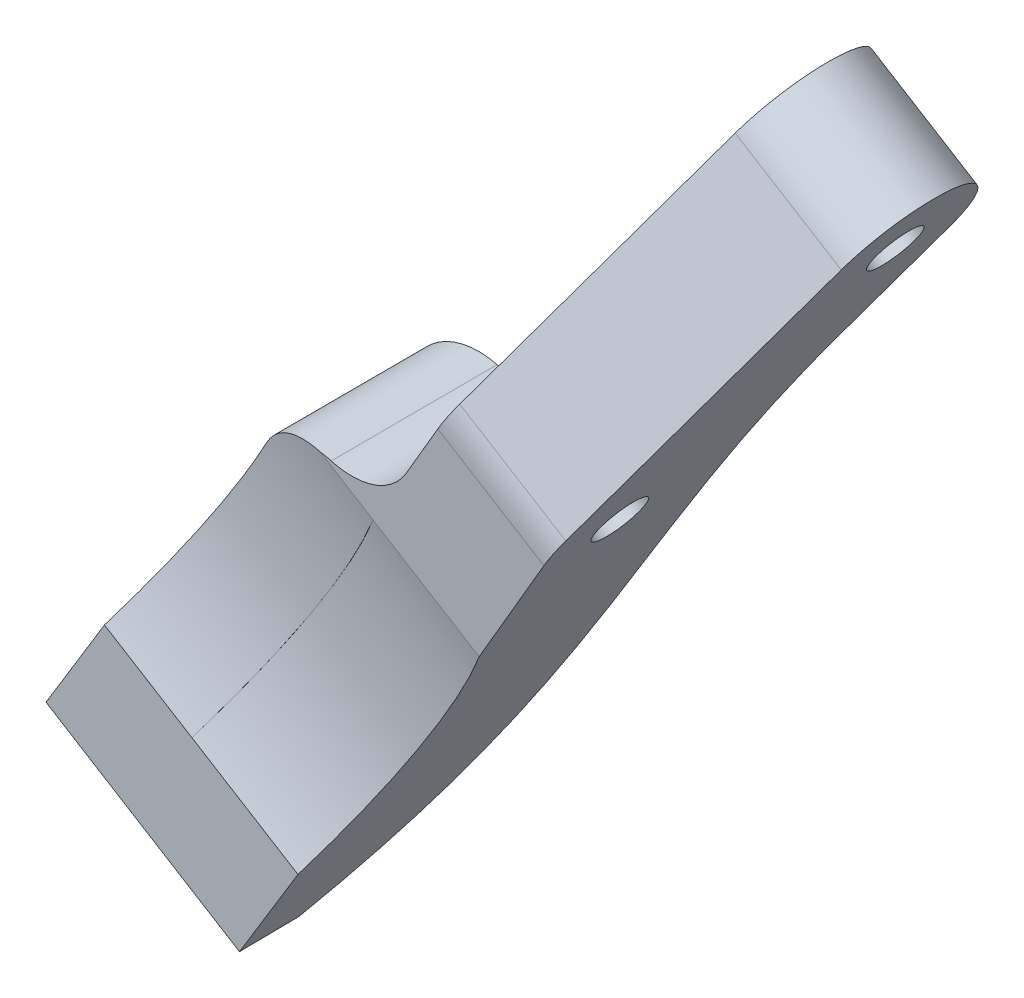
ISO-10303-21;
HEADER;
FILE_DESCRIPTION(('STEP AP214'),'2;1');
FILE_NAME('part.step','',(''),(''),'','','');
FILE_SCHEMA(('AUTOMOTIVE_DESIGN { 1 0 10303 214 1 1 1 1 }'));
ENDSEC;
DATA;
#1=APPLICATION_CONTEXT('core data for automotive mechanical design processes');
#2=APPLICATION_PROTOCOL_DEFINITION('international standard','automotive_design',2000,#1);
#3=PRODUCT_CONTEXT('',#1,'mechanical');
#4=PRODUCT('Part','Part','',(#3));
#5=PRODUCT_RELATED_PRODUCT_CATEGORY('part','',(#4));
#6=PRODUCT_DEFINITION_FORMATION('','',#4);
#7=PRODUCT_DEFINITION_CONTEXT('part definition',#1,'design');
#8=PRODUCT_DEFINITION('design','',#6,#7);
#9=PRODUCT_DEFINITION_SHAPE('','',#8);
#10=(LENGTH_UNIT() NAMED_UNIT(*) SI_UNIT(.MILLI.,.METRE.));
#11=(NAMED_UNIT(*) PLANE_ANGLE_UNIT() SI_UNIT($,.RADIAN.));
#12=(NAMED_UNIT(*) SI_UNIT($,.STERADIAN.) SOLID_ANGLE_UNIT());
#13=UNCERTAINTY_MEASURE_WITH_UNIT(LENGTH_MEASURE(1.E-05),#10,'distance_accuracy_value','');
#14=(GEOMETRIC_REPRESENTATION_CONTEXT(3) GLOBAL_UNCERTAINTY_ASSIGNED_CONTEXT((#13)) GLOBAL_UNIT_ASSIGNED_CONTEXT((#10,
#11,#12)) REPRESENTATION_CONTEXT('',''));
#15=CARTESIAN_POINT('',(0.,0.,0.));
#16=DIRECTION('',(0.,0.,1.));
#17=DIRECTION('',(1.,0.,0.));
#18=AXIS2_PLACEMENT_3D('',#15,#16,#17);
#19=CARTESIAN_POINT('',(-145.465846065261,199.758902537382,63.4536295403305));
#20=DIRECTION('',(-0.849388113162932,0.527762814669667,0.00249893366544897));
#21=DIRECTION('',(-0.527764462529552,-0.84939076524936,0.));
#22=AXIS2_PLACEMENT_3D('',#19,#20,#21);
#23=PLANE('',#22);
#24=CARTESIAN_POINT('',(-137.431299521987,212.655895269951,70.6147412750275));
#25=DIRECTION('',(0.849388113162932,-0.527762814669668,-0.00249893366544826));
#26=DIRECTION('',(0.527764462529552,0.84939076524936,0.));
#27=AXIS2_PLACEMENT_3D('',#24,#25,#26);
#28=CIRCLE('',#27,1.75000000000017);
#29=CARTESIAN_POINT('',(-136.50771171256,214.142329109138,70.6147412750275));
#30=VERTEX_POINT('',#29);
#31=EDGE_CURVE('E465',#30,#30,#28,.T.);
#32=ORIENTED_EDGE('',*,*,#31,.F.);
#33=EDGE_LOOP('',(#32));
#34=FACE_BOUND('',#33,.T.);
#35=DIRECTION('',(-0.490876600540356,-0.791744449357565,0.363566898869286));
#36=VECTOR('',#35,1.);
#37=CARTESIAN_POINT('',(-137.026355520671,213.283583566107,75.6905379942665));
#38=LINE('',#37,#36);
#39=CARTESIAN_POINT('',(-125.662736276465,231.6121868267,67.2740932014216));
#40=VERTEX_POINT('',#39);
#41=CARTESIAN_POINT('',(-136.462021488353,214.193808940833,75.2725649765459));
#42=VERTEX_POINT('',#41);
#43=EDGE_CURVE('E396',#40,#42,#38,.T.);
#44=ORIENTED_EDGE('',*,*,#43,.T.);
#45=CARTESIAN_POINT('',(-137.431299521987,212.655895269951,70.6147412750274));
#46=DIRECTION('',(-0.849388113162932,0.527762814669667,0.00249893366544897));
#47=DIRECTION('',(-0.527764462529552,-0.84939076524936,0.));
#48=AXIS2_PLACEMENT_3D('',#45,#46,#47);
#49=CIRCLE('',#48,5.);
#50=CARTESIAN_POINT('',(-137.631356269382,212.31032226088,75.5987714307571));
#51=VERTEX_POINT('',#50);
#52=EDGE_CURVE('E12',#42,#51,#49,.F.);
#53=ORIENTED_EDGE('',*,*,#52,.T.);
#54=DIRECTION('',(-0.526249869482533,-0.846575208276272,-0.079821623646753));
#55=VECTOR('',#54,1.);
#56=CARTESIAN_POINT('',(-142.838770843056,203.933183694321,74.8089103583332));
#57=LINE('',#56,#55);
#58=CARTESIAN_POINT('',(-142.838770843056,203.933183694321,74.8089103583333));
#59=VERTEX_POINT('',#58);
#60=EDGE_CURVE('E398',#51,#59,#57,.T.);
#61=ORIENTED_EDGE('',*,*,#60,.T.);
#62=CARTESIAN_POINT('',(-147.368661795779,196.520400632689,100.642218728456));
#63=DIRECTION('',(-0.849388113162932,0.527762814669667,0.00249893366544821));
#64=DIRECTION('',(-0.527764462529552,-0.84939076524936,0.));
#65=AXIS2_PLACEMENT_3D('',#62,#63,#64);
#66=CIRCLE('',#65,27.2548910492821);
#67=CARTESIAN_POINT('',(-153.799234271672,186.286623782076,76.2138206002041));
#68=VERTEX_POINT('',#67);
#69=EDGE_CURVE('E405',#59,#68,#66,.T.);
#70=ORIENTED_EDGE('',*,*,#69,.T.);
#71=DIRECTION('',(-0.52760719811768,-0.849001485928969,-0.0287597180934248));
#72=VECTOR('',#71,1.);
#73=CARTESIAN_POINT('',(-158.020091856613,179.494611894644,75.9837428554567));
#74=LINE('',#73,#72);
#75=CARTESIAN_POINT('',(-158.020091856613,179.494611894644,75.9837428554567));
#76=VERTEX_POINT('',#75);
#77=EDGE_CURVE('E403',#68,#76,#74,.T.);
#78=ORIENTED_EDGE('',*,*,#77,.T.);
#79=DIRECTION('',(0.0130567113748942,0.0257466180759731,-0.999583230124297));
#80=VECTOR('',#79,1.);
#81=CARTESIAN_POINT('',(-157.967865011114,179.597598366948,71.9854099349596));
#82=LINE('',#81,#80);
#83=CARTESIAN_POINT('',(-157.967865011114,179.597598366948,71.9854099349596));
#84=VERTEX_POINT('',#83);
#85=EDGE_CURVE('E176',#76,#84,#82,.T.);
#86=ORIENTED_EDGE('',*,*,#85,.T.);
#87=CARTESIAN_POINT('',(-157.967865011114,179.597598366948,71.9854099349596));
#88=CARTESIAN_POINT('',(-150.903306301804,191.036408616379,57.4085919158969));
#89=CARTESIAN_POINT('',(-140.393177536833,207.904078200175,67.432733277616));
#90=CARTESIAN_POINT('',(-131.869451995061,221.652161482444,61.119650807146));
#91=B_SPLINE_CURVE_WITH_KNOTS('',3,(#87,#88,#89,#90),.UNSPECIFIED.,.F.,.F.,(4,4),(0.,1.),.UNSPECIFIED.);
#92=CARTESIAN_POINT('',(-131.869451995061,221.652161482444,61.119650807146));
#93=VERTEX_POINT('',#92);
#94=EDGE_CURVE('E168',#84,#93,#91,.T.);
#95=ORIENTED_EDGE('',*,*,#94,.T.);
#96=DIRECTION('',(0.490876600540355,0.791744449357564,-0.36356689886929));
#97=VECTOR('',#96,1.);
#98=CARTESIAN_POINT('',(-127.601292343734,228.536359484936,57.9584457983846));
#99=LINE('',#98,#97);
#100=CARTESIAN_POINT('',(-127.601292343734,228.536359484936,57.9584457983846));
#101=VERTEX_POINT('',#100);
#102=EDGE_CURVE('E157',#93,#101,#99,.T.);
#103=ORIENTED_EDGE('',*,*,#102,.T.);
#104=CARTESIAN_POINT('',(-126.632014310099,230.074273155818,62.6162694999031));
#105=DIRECTION('',(0.849388113162932,-0.527762814669667,-0.00249893366544821));
#106=DIRECTION('',(-0.527764462529552,-0.84939076524936,0.));
#107=AXIS2_PLACEMENT_3D('',#104,#105,#106);
#108=CIRCLE('',#107,4.99999999999998);
#109=EDGE_CURVE('E166',#101,#40,#108,.T.);
#110=ORIENTED_EDGE('',*,*,#109,.T.);
#111=EDGE_LOOP('',(#44,#53,#61,#70,#78,#86,#95,#103,#110));
#112=FACE_BOUND('',#111,.T.);
#113=CARTESIAN_POINT('',(-126.632014310099,230.074273155818,62.6162694999032));
#114=DIRECTION('',(0.849388113162932,-0.527762814669668,-0.00249893366544826));
#115=DIRECTION('',(0.527764462529552,0.84939076524936,0.));
#116=AXIS2_PLACEMENT_3D('',#113,#114,#115);
#117=CIRCLE('',#116,1.75000000000017);
#118=CARTESIAN_POINT('',(-125.708426500672,231.560706995004,62.6162694999032));
#119=VERTEX_POINT('',#118);
#120=EDGE_CURVE('E452',#119,#119,#117,.T.);
#121=ORIENTED_EDGE('',*,*,#120,.F.);
#122=EDGE_LOOP('',(#121));
#123=FACE_BOUND('',#122,.T.);
#124=ADVANCED_FACE('F53',(#34,#112,#123),#23,.F.);
#125=CARTESIAN_POINT('',(-130.428152235647,240.05689299818,65.4774996432315));
#126=DIRECTION('',(0.849388113162932,-0.527762814669667,-0.00249893366544821));
#127=DIRECTION('',(-0.193855606726907,-0.307582734176409,-0.931564740303704));
#128=AXIS2_PLACEMENT_3D('',#125,#126,#127);
#129=PLANE('',#128);
#130=CARTESIAN_POINT('',(-154.588460757663,201.00638455738,100.663459664612));
#131=DIRECTION('',(-0.849388113162932,0.527762814669667,0.00249893366544821));
#132=DIRECTION('',(-0.527764462529552,-0.84939076524936,0.));
#133=AXIS2_PLACEMENT_3D('',#130,#131,#132);
#134=CIRCLE('',#133,27.2548910492821);
#135=CARTESIAN_POINT('',(-150.058569804941,208.419167619013,74.8301512944895));
#136=VERTEX_POINT('',#135);
#137=CARTESIAN_POINT('',(-155.611855002644,199.488080143753,73.4701424334406));
#138=VERTEX_POINT('',#137);
#139=EDGE_CURVE('E182',#136,#138,#134,.T.);
#140=ORIENTED_EDGE('',*,*,#139,.F.);
#141=CARTESIAN_POINT('',(-150.058569804941,208.419167619013,74.8301512944896));
#142=CARTESIAN_POINT('',(-151.869827243608,205.509300518767,73.7333286059708));
#143=CARTESIAN_POINT('',(-153.727835402388,202.521388485417,73.2286415312521));
#144=CARTESIAN_POINT('',(-155.622355851571,199.471173608172,73.4714808235708));
#145=CARTESIAN_POINT('',(-157.513723707257,196.426034467948,73.713916017019));
#146=CARTESIAN_POINT('',(-159.311794851092,193.527599228967,74.6847635834588));
#147=CARTESIAN_POINT('',(-161.019033233556,190.772607706768,76.2350615363604));
#148=(BOUNDED_CURVE() B_SPLINE_CURVE(3,(#141,#142,#143,#144,#145,#146,#147),.UNSPECIFIED.,.F.,
.F.) B_SPLINE_CURVE_WITH_KNOTS((4,3,4),(0.,1.07962493738538,2.15745331535274),
.UNSPECIFIED.) CURVE() GEOMETRIC_REPRESENTATION_ITEM() RATIONAL_B_SPLINE_CURVE((1.,1.,1.,1.,1.,
1.,1.)) REPRESENTATION_ITEM(''));
#149=EDGE_CURVE('E221',#136,#138,#148,.T.);
#150=ORIENTED_EDGE('',*,*,#149,.T.);
#151=EDGE_LOOP('',(#140,#150));
#152=FACE_BOUND('',#151,.T.);
#153=ADVANCED_FACE('F309',(#152),#129,.T.);
#154=CARTESIAN_POINT('',(-215.42898922936,132.511668818373,148.288861039054));
#155=CARTESIAN_POINT('',(-192.415208294728,118.212177674066,148.221153578759));
#156=CARTESIAN_POINT('',(-203.112082646933,152.454989137968,122.874491480027));
#157=CARTESIAN_POINT('',(-180.098301712301,138.155497993662,122.806784019732));
#158=CARTESIAN_POINT('',(-190.795176064506,172.398309457565,97.4601219209998));
#159=CARTESIAN_POINT('',(-167.781395129874,158.098818313259,97.3924144607051));
#160=CARTESIAN_POINT('',(-178.478269482079,192.341629777161,72.0457523619727));
#161=CARTESIAN_POINT('',(-155.464488547447,178.042138632855,71.978044901678));
#162=CARTESIAN_POINT('',(-171.41371077277,203.780440026592,57.4689343429102));
#163=CARTESIAN_POINT('',(-148.399929838138,189.480948882286,57.4012268826155));
#164=CARTESIAN_POINT('',(-160.903582007799,220.648109610388,67.4930757046292));
#165=CARTESIAN_POINT('',(-137.889801073167,206.348618466081,67.4253682443345));
#166=CARTESIAN_POINT('',(-152.379856466026,234.396192892657,61.1799932341592));
#167=CARTESIAN_POINT('',(-129.366075531394,220.096701748351,61.1122857738645));
#168=(BOUNDED_SURFACE() B_SPLINE_SURFACE(3,1,((#154,#155),(#156,#157),(#158,#159),(#160,#161),
(#162,#163),(#164,#165),(#166,#167)),.UNSPECIFIED.,.F.,.F.,.F.) B_SPLINE_SURFACE_WITH_KNOTS((4,
3,4),(2,2),(-1.74347855106593,0.,1.),(-1.56472704328177,1.14472704231095),
.UNSPECIFIED.) GEOMETRIC_REPRESENTATION_ITEM() RATIONAL_B_SPLINE_SURFACE(((1.,1.),(1.,1.),(1.,
1.),(1.,1.),(1.,1.),(1.,1.),(1.,1.))) REPRESENTATION_ITEM('') SURFACE());
#169=CARTESIAN_POINT('',(-152.920866902529,210.497951347866,63.5029667227939));
#170=CARTESIAN_POINT('',(-152.625070573472,210.422023509831,63.5033189485374));
#171=CARTESIAN_POINT('',(-152.323532656278,210.373505854643,63.5040097877256));
#172=CARTESIAN_POINT('',(-152.020063003257,210.352678450499,63.5050106707307));
#173=CARTESIAN_POINT('',(-151.731963425906,210.332905908925,63.5059608611957));
#174=CARTESIAN_POINT('',(-151.442122563601,210.338090176062,63.5071919140641));
#175=CARTESIAN_POINT('',(-151.153803010597,210.368466569789,63.508638932181));
#176=CARTESIAN_POINT('',(-151.123871372667,210.371620068084,63.5087891530796));
#177=CARTESIAN_POINT('',(-151.093979844519,210.375042542246,63.508941533581));
#178=CARTESIAN_POINT('',(-151.064131939828,210.378733007705,63.5090959555785));
#179=CARTESIAN_POINT('',(-150.792789154086,210.412282470854,63.5104997825942));
#180=CARTESIAN_POINT('',(-150.525051019552,210.467980538837,63.5120764742786));
#181=CARTESIAN_POINT('',(-150.263560887233,210.545081957469,63.513709997375));
#182=CARTESIAN_POINT('',(-150.007429878296,210.62060321699,63.5153100421456));
#183=CARTESIAN_POINT('',(-149.757293345746,210.716659593348,63.5169646670379));
#184=CARTESIAN_POINT('',(-149.515642369181,210.832539781408,63.5185150778539));
#185=CARTESIAN_POINT('',(-149.314041200464,210.92921467044,63.5198085327241));
#186=CARTESIAN_POINT('',(-149.119491003492,211.039138170561,63.5210204818501));
#187=CARTESIAN_POINT('',(-148.933217406361,211.161448571951,63.5220390164212));
#188=CARTESIAN_POINT('',(-148.654553579997,211.344423963957,63.5235627360747));
#189=CARTESIAN_POINT('',(-148.394412394015,211.555121670087,63.524653800545));
#190=CARTESIAN_POINT('',(-148.156907402327,211.79064057354,63.5248944444397));
#191=CARTESIAN_POINT('',(-148.009830541506,211.936487533378,63.5250434650911));
#192=CARTESIAN_POINT('',(-147.871959109773,212.091332798125,63.5248644520813));
#193=CARTESIAN_POINT('',(-147.744090562788,212.25428151565,63.5242673426161));
#194=CARTESIAN_POINT('',(-147.684410298605,212.330334796457,63.5239886528878));
#195=CARTESIAN_POINT('',(-147.626948730309,212.40810274853,63.5236191892214));
#196=CARTESIAN_POINT('',(-147.571778281306,212.487487363484,63.5231510863646));
#197=CARTESIAN_POINT('',(-147.522894809596,212.557825663234,63.5227363264131));
#198=CARTESIAN_POINT('',(-147.475827375424,212.629408217179,63.5222442769016));
#199=CARTESIAN_POINT('',(-147.430622514171,212.702164207707,63.5216702162684));
#200=(BOUNDED_CURVE() B_SPLINE_CURVE(3,(#169,#170,#171,#172,#173,#174,#175,#176,#177,#178,#179,
#180,#181,#182,#183,#184,#185,#186,#187,#188,#189,#190,#191,#192,#193,#194,#195,#196,#197,#198,
#199),.UNSPECIFIED.,.F.,.F.) B_SPLINE_CURVE_WITH_KNOTS((4,3,3,3,3,3,3,3,3,3,4),(0.,
0.09161580979346,0.178591478752063,0.187620780458526,0.269704796193467,0.350106536715364,
0.417182966889678,0.517528775308878,0.579668717690687,0.608671379135495,0.63436902716781),
.UNSPECIFIED.) CURVE() GEOMETRIC_REPRESENTATION_ITEM() RATIONAL_B_SPLINE_CURVE((1.,1.,1.,1.,1.,
1.,1.,1.,1.,1.,1.,1.,1.,1.,1.,1.,1.,1.,1.,1.,1.,1.,1.,1.,1.,1.,1.,1.,1.,1.,1.)) REPRESENTATION_ITEM(''));
#201=CARTESIAN_POINT('',(-152.920866910743,210.497951349974,63.5029667227468));
#202=VERTEX_POINT('',#201);
#203=CARTESIAN_POINT('',(-147.430622514171,212.702164207707,63.5216702162684));
#204=VERTEX_POINT('',#203);
#205=EDGE_CURVE('E495',#202,#204,#200,.T.);
#206=CARTESIAN_POINT('',(-165.187663972998,184.08358229164,72.0066508711159));
#207=CARTESIAN_POINT('',(-158.123105263689,195.522392541071,57.4298328520532));
#208=CARTESIAN_POINT('',(-147.612976498718,212.390062124867,67.4539742137723));
#209=CARTESIAN_POINT('',(-139.089250956945,226.138145407136,61.1408917433023));
#210=(BOUNDED_CURVE() B_SPLINE_CURVE(3,(#206,#207,#208,#209),.UNSPECIFIED.,.F.,
.F.) B_SPLINE_CURVE_WITH_KNOTS((4,4),(-5.55049235151538,0.),
.UNSPECIFIED.) CURVE() GEOMETRIC_REPRESENTATION_ITEM() RATIONAL_B_SPLINE_CURVE((1.,1.,1.,1.)) REPRESENTATION_ITEM(''));
#211=CARTESIAN_POINT('',(-165.187663972998,184.08358229164,72.0066508711157));
#212=VERTEX_POINT('',#211);
#213=EDGE_CURVE('E186',#212,#204,#210,.T.);
#214=DIRECTION('',(0.849388113162932,-0.527762814669667,-0.00249893366544821));
#215=VECTOR('',#214,1.);
#216=CARTESIAN_POINT('',(-165.187663972998,184.08358229164,72.0066508711158));
#217=LINE('',#216,#215);
#218=CARTESIAN_POINT('',(-171.133380765138,187.777921994327,72.0241434067739));
#219=VERTEX_POINT('',#218);
#220=EDGE_CURVE('E475',#219,#212,#217,.T.);
#221=CARTESIAN_POINT('',(-208.084100512419,127.947961035539,148.267252083855));
#222=CARTESIAN_POINT('',(-195.767193929992,147.891281355135,122.852882524828));
#223=CARTESIAN_POINT('',(-183.450287347565,167.834601674731,97.438512965801));
#224=CARTESIAN_POINT('',(-171.133380765138,187.777921994327,72.0241434067739));
#225=CARTESIAN_POINT('',(-164.068822055829,199.216732243758,57.4473253877114));
#226=CARTESIAN_POINT('',(-153.558693290858,216.084401827554,67.4714667494304));
#227=CARTESIAN_POINT('',(-145.034967749085,229.832485109823,61.1583842789604));
#228=(BOUNDED_CURVE() B_SPLINE_CURVE(3,(#221,#222,#223,#224,#225,#226,#227),.UNSPECIFIED.,.F.,
.F.) B_SPLINE_CURVE_WITH_KNOTS((4,3,4),(-1.74347855106593,0.,1.),
.UNSPECIFIED.) CURVE() GEOMETRIC_REPRESENTATION_ITEM() RATIONAL_B_SPLINE_CURVE((1.,1.,1.,1.,1.,
1.,1.)) REPRESENTATION_ITEM(''));
#229=CARTESIAN_POINT('',(-158.411097440024,208.293742716824,63.4880780384255));
#230=VERTEX_POINT('',#229);
#231=EDGE_CURVE('E292',#219,#230,#228,.T.);
#232=CARTESIAN_POINT('',(-152.920866910743,210.497951349974,63.502966722784));
#233=CARTESIAN_POINT('',(-153.220909769043,210.574970832685,63.5026094585843));
#234=CARTESIAN_POINT('',(-153.527419108996,210.623927456602,63.501906612146));
#235=CARTESIAN_POINT('',(-153.836420053296,210.644215899626,63.5008934937187));
#236=CARTESIAN_POINT('',(-153.99280034612,210.654483546763,63.5003807711551));
#237=CARTESIAN_POINT('',(-154.149818649104,210.657408907709,63.4997891417239));
#238=CARTESIAN_POINT('',(-154.306958706712,210.652915168688,63.4991282446655));
#239=CARTESIAN_POINT('',(-154.587633633984,210.64488869923,63.4979477866931));
#240=CARTESIAN_POINT('',(-154.866632621486,210.613251530309,63.4965519137593));
#241=CARTESIAN_POINT('',(-155.141043813619,210.558579037911,63.4950429141149));
#242=CARTESIAN_POINT('',(-155.400193485323,210.506947184464,63.4936178382665));
#243=CARTESIAN_POINT('',(-155.655251444462,210.434771052176,63.4920917563712));
#244=CARTESIAN_POINT('',(-155.903758492344,210.342545743858,63.4905989653951));
#245=CARTESIAN_POINT('',(-155.918393260596,210.337114525606,63.4905110538041));
#246=CARTESIAN_POINT('',(-155.933005307573,210.3316137774,63.4904232723661));
#247=CARTESIAN_POINT('',(-155.947594130287,210.326043601494,63.4903356540845));
#248=CARTESIAN_POINT('',(-156.218189979307,210.222727075682,63.4887104959914));
#249=CARTESIAN_POINT('',(-156.478764639441,210.096298152666,63.4871492261361));
#250=CARTESIAN_POINT('',(-156.726523924577,209.948434991423,63.4858886253975));
#251=CARTESIAN_POINT('',(-156.984513672702,209.794466272532,63.4845759720014));
#252=CARTESIAN_POINT('',(-157.228607598695,209.617257047752,63.4835906450292));
#253=CARTESIAN_POINT('',(-157.455647324277,209.418707579144,63.4832484041851));
#254=CARTESIAN_POINT('',(-157.670735023104,209.230610327897,63.4829241798874));
#255=CARTESIAN_POINT('',(-157.869302786081,209.024421782541,63.4831829924299));
#256=CARTESIAN_POINT('',(-158.049168061128,208.802406391855,63.4842779313432));
#257=CARTESIAN_POINT('',(-158.180291812457,208.640554745551,63.485076153778));
#258=CARTESIAN_POINT('',(-158.301170245839,208.470669263527,63.4863171980779));
#259=CARTESIAN_POINT('',(-158.411097440165,208.293742716597,63.4880780384292));
#260=(BOUNDED_CURVE() B_SPLINE_CURVE(3,(#232,#233,#234,#235,#236,#237,#238,#239,#240,#241,#242,
#243,#244,#245,#246,#247,#248,#249,#250,#251,#252,#253,#254,#255,#256,#257,#258,#259),
.UNSPECIFIED.,.F.,.F.) B_SPLINE_CURVE_WITH_KNOTS((4,3,3,3,3,3,3,3,3,4),(-0.63441133775554,
-0.541223220545396,-0.494062247979089,-0.409825924355365,-0.330274447453344,-0.32558960073164,
-0.238694304172922,-0.148210931733228,-0.0624908652990217,0.),
.UNSPECIFIED.) CURVE() GEOMETRIC_REPRESENTATION_ITEM() RATIONAL_B_SPLINE_CURVE((1.,1.,1.,1.,1.,
1.,1.,1.,1.,1.,1.,1.,1.,1.,1.,1.,1.,1.,1.,1.,1.,1.,1.,1.,1.,1.,1.,1.)) REPRESENTATION_ITEM(''));
#261=EDGE_CURVE('E243',#202,#230,#260,.T.);
#262=ORIENTED_EDGE('',*,*,#205,.T.);
#263=ORIENTED_EDGE('',*,*,#213,.F.);
#264=ORIENTED_EDGE('',*,*,#220,.F.);
#265=ORIENTED_EDGE('',*,*,#231,.T.);
#266=ORIENTED_EDGE('',*,*,#261,.F.);
#267=EDGE_LOOP('',(#262,#263,#264,#265,#266));
#268=FACE_BOUND('',#267,.T.);
#269=ADVANCED_FACE('F300',(#268),#168,.T.);
#270=CARTESIAN_POINT('',(-130.590334849949,239.73708399658,77.893721218383));
#271=DIRECTION('',(-0.0130567113748932,-0.0257466180759885,0.999583230124296));
#272=DIRECTION('',(-0.527607198117678,-0.84900148592897,-0.0287597180934335));
#273=AXIS2_PLACEMENT_3D('',#270,#271,#272);
#274=PLANE('',#273);
#275=DIRECTION('',(0.849388113162932,-0.527762814669667,-0.00249893366544821));
#276=VECTOR('',#275,1.);
#277=CARTESIAN_POINT('',(-165.239890818498,183.980595819336,76.004983791613));
#278=LINE('',#277,#276);
#279=CARTESIAN_POINT('',(-171.185607610638,187.674935522024,76.0224763272712));
#280=VERTEX_POINT('',#279);
#281=EDGE_CURVE('E224',#280,#76,#278,.T.);
#282=ORIENTED_EDGE('',*,*,#281,.T.);
#283=ORIENTED_EDGE('',*,*,#77,.F.);
#284=DIRECTION('',(-0.849388113162932,0.527762814669667,0.00249893366544821));
#285=VECTOR('',#284,1.);
#286=CARTESIAN_POINT('',(-153.799234271672,186.286623782076,76.2138206002041));
#287=LINE('',#286,#285);
#288=CARTESIAN_POINT('',(-161.019033233556,190.772607706768,76.2350615363604));
#289=VERTEX_POINT('',#288);
#290=EDGE_CURVE('E429',#68,#289,#287,.T.);
#291=ORIENTED_EDGE('',*,*,#290,.T.);
#292=DIRECTION('',(0.849388113162934,-0.527762814669664,-0.00249893366544669));
#293=VECTOR('',#292,1.);
#294=CARTESIAN_POINT('',(-154.648622384835,186.814386596746,76.2163195338695));
#295=LINE('',#294,#293);
#296=CARTESIAN_POINT('',(-166.964750025697,194.466947409455,76.2525540720185));
#297=VERTEX_POINT('',#296);
#298=EDGE_CURVE('E286',#297,#289,#295,.T.);
#299=ORIENTED_EDGE('',*,*,#298,.F.);
#300=DIRECTION('',(0.527607198117679,0.84900148592897,0.0287597180934335));
#301=VECTOR('',#300,1.);
#302=CARTESIAN_POINT('',(-151.434375216125,219.457719592626,77.0991103794422));
#303=LINE('',#302,#301);
#304=EDGE_CURVE('E268',#280,#297,#303,.T.);
#305=ORIENTED_EDGE('',*,*,#304,.F.);
#306=EDGE_LOOP('',(#282,#283,#291,#299,#305));
#307=FACE_BOUND('',#306,.T.);
#308=ADVANCED_FACE('F310',(#307),#274,.T.);
#309=CARTESIAN_POINT('',(-165.077708204196,184.300404820936,63.5887622164615));
#310=DIRECTION('',(-0.527607198117678,-0.84900148592897,-0.0287597180934335));
#311=DIRECTION('',(-0.849388113162932,0.527762814669667,0.00249893366544821));
#312=AXIS2_PLACEMENT_3D('',#309,#310,#311);
#313=PLANE('',#312);
#314=ORIENTED_EDGE('',*,*,#220,.T.);
#315=DIRECTION('',(-0.849388113162932,0.527762814669667,0.00249893366544821));
#316=VECTOR('',#315,1.);
#317=CARTESIAN_POINT('',(-157.967865011114,179.597598366948,71.9854099349596));
#318=LINE('',#317,#316);
#319=EDGE_CURVE('E408',#84,#212,#318,.T.);
#320=ORIENTED_EDGE('',*,*,#319,.F.);
#321=ORIENTED_EDGE('',*,*,#85,.F.);
#322=ORIENTED_EDGE('',*,*,#281,.F.);
#323=DIRECTION('',(-0.0130567113748928,-0.0257466180759879,0.999583230124297));
#324=VECTOR('',#323,1.);
#325=CARTESIAN_POINT('',(-171.238905971045,187.569836122175,80.1028412619703));
#326=LINE('',#325,#324);
#327=EDGE_CURVE('E500',#219,#280,#326,.T.);
#328=ORIENTED_EDGE('',*,*,#327,.F.);
#329=EDGE_LOOP('',(#314,#320,#321,#322,#328));
#330=FACE_BOUND('',#329,.T.);
#331=ADVANCED_FACE('F323',(#330),#313,.T.);
#332=CARTESIAN_POINT('',(-157.225865668844,179.570494402826,79.8059640096468));
#333=CARTESIAN_POINT('',(-170.922254803268,188.080673399183,79.8462593320944));
#334=CARTESIAN_POINT('',(-155.906697409653,181.69925240625,78.6080622562882));
#335=CARTESIAN_POINT('',(-169.603086544077,190.209431402607,78.6483575787358));
#336=CARTESIAN_POINT('',(-154.587529150463,183.828010409674,77.4101605029296));
#337=CARTESIAN_POINT('',(-168.283918284887,192.338189406031,77.4504558253772));
#338=CARTESIAN_POINT('',(-153.268360891272,185.956768413098,76.2122587495709));
#339=CARTESIAN_POINT('',(-166.964750025697,194.466947409455,76.2525540720185));
#340=CARTESIAN_POINT('',(-151.561122508808,188.711759935297,74.6619607966693));
#341=CARTESIAN_POINT('',(-165.257511643231,197.221938931655,74.7022561191169));
#342=CARTESIAN_POINT('',(-149.763051364973,191.610195174278,73.6911132302295));
#343=CARTESIAN_POINT('',(-163.459440499397,200.120374170636,73.7314085526771));
#344=CARTESIAN_POINT('',(-145.977163060104,197.705549191747,73.2058387444626));
#345=CARTESIAN_POINT('',(-159.673552194528,206.215728188104,73.2461340669102));
#346=CARTESIAN_POINT('',(-144.119154901324,200.693461225097,73.7105258191813));
#347=CARTESIAN_POINT('',(-157.815544035748,209.203640221455,73.7508211416289));
#348=CARTESIAN_POINT('',(-142.307897462656,203.603328325343,74.8073485077001));
#349=CARTESIAN_POINT('',(-156.004286597081,212.1135073217,74.8476438301477));
#350=CARTESIAN_POINT('',(-140.910676389964,205.848027253503,75.6534478752935));
#351=CARTESIAN_POINT('',(-154.607065524389,214.35820624986,75.6937431977412));
#352=CARTESIAN_POINT('',(-139.513455317272,208.092726181662,76.4995472428869));
#353=CARTESIAN_POINT('',(-153.209844451696,216.60290517802,76.5398425653346));
#354=CARTESIAN_POINT('',(-138.11623424458,210.337425109822,77.3456466104803));
#355=CARTESIAN_POINT('',(-151.812623379004,218.847604106179,77.385941932928));
#356=(BOUNDED_SURFACE() B_SPLINE_SURFACE(3,1,((#332,#333),(#334,#335),(#336,#337),(#338,#339),
(#340,#341),(#342,#343),(#344,#345),(#346,#347),(#348,#349),(#350,#351),(#352,#353),(#354,
#355)),.UNSPECIFIED.,.F.,.F.,.F.) B_SPLINE_SURFACE_WITH_KNOTS((4,3,2,3,4),(2,2),
(-0.832832860153062,0.,1.07783386624527,2.1574643010566,2.99030140197588),(-0.81250068398321,
0.8),.UNSPECIFIED.) GEOMETRIC_REPRESENTATION_ITEM() RATIONAL_B_SPLINE_SURFACE(((1.,1.),(1.,1.),
(1.,1.),(1.,1.),(1.,1.),(1.,1.),(1.,1.),(1.,1.),(1.,1.),(1.,1.),(1.,1.),(1.,1.))) REPRESENTATION_ITEM('') SURFACE());
#357=CARTESIAN_POINT('',(-155.915760991913,198.998757442507,73.5150380978983));
#358=VERTEX_POINT('',#357);
#359=EDGE_CURVE('E194',#358,#289,#148,.T.);
#360=CARTESIAN_POINT('',(-164.976538011128,184.386333696496,79.8287667964363));
#361=CARTESIAN_POINT('',(-163.657369751938,186.51509169992,78.6308650430777));
#362=CARTESIAN_POINT('',(-162.338201492747,188.643849703344,77.4329632897191));
#363=CARTESIAN_POINT('',(-161.019033233557,190.772607706768,76.2350615363604));
#364=CARTESIAN_POINT('',(-159.311794851092,193.527599228968,74.6847635834588));
#365=CARTESIAN_POINT('',(-157.513723707257,196.426034467948,73.713916017019));
#366=CARTESIAN_POINT('',(-153.727835402389,202.521388485417,73.2286415312521));
#367=CARTESIAN_POINT('',(-151.869827243608,205.509300518767,73.7333286059708));
#368=CARTESIAN_POINT('',(-150.058569804941,208.419167619013,74.8301512944896));
#369=CARTESIAN_POINT('',(-148.661348732249,210.663866547173,75.676250662083));
#370=CARTESIAN_POINT('',(-147.264127659557,212.908565475332,76.5223500296764));
#371=CARTESIAN_POINT('',(-145.866906586865,215.153264403492,77.3684493972698));
#372=(BOUNDED_CURVE() B_SPLINE_CURVE(3,(#360,#361,#362,#363,#364,#365,#366,#367,#368,#369,#370,
#371),.UNSPECIFIED.,.F.,.F.) B_SPLINE_CURVE_WITH_KNOTS((4,3,2,3,4),(-0.832832860153062,0.,
1.07783386624527,2.1574643010566,2.99030140197588),
.UNSPECIFIED.) CURVE() GEOMETRIC_REPRESENTATION_ITEM() RATIONAL_B_SPLINE_CURVE((1.,1.,1.,1.,1.,
1.,1.,1.,1.,1.,1.,1.)) REPRESENTATION_ITEM(''));
#373=EDGE_CURVE('E226',#138,#358,#372,.F.);
#374=DIRECTION('',(0.849388113162934,-0.527762814669664,-0.00249893366544669));
#375=VECTOR('',#374,1.);
#376=CARTESIAN_POINT('',(-143.688158956219,204.460946508991,74.8114092919987));
#377=LINE('',#376,#375);
#378=CARTESIAN_POINT('',(-153.639405409988,210.644100895689,74.840686255487));
#379=VERTEX_POINT('',#378);
#380=EDGE_CURVE('E262',#379,#136,#377,.T.);
#381=CARTESIAN_POINT('',(-158.373761958475,208.305140821113,73.7711915840256));
#382=CARTESIAN_POINT('',(-158.338251222876,208.36224069315,73.7818847331845));
#383=CARTESIAN_POINT('',(-158.30158685263,208.418630173256,73.7928232654281));
#384=CARTESIAN_POINT('',(-158.263788026508,208.474274384162,73.803999987317));
#385=CARTESIAN_POINT('',(-158.163513769502,208.621889600762,73.833650047865));
#386=CARTESIAN_POINT('',(-158.055693028133,208.763631788512,73.8648531158896));
#387=CARTESIAN_POINT('',(-157.940889873414,208.899003991902,73.8973964780042));
#388=CARTESIAN_POINT('',(-157.823070263456,209.037933102707,73.9307949176241));
#389=CARTESIAN_POINT('',(-157.697896506545,209.170153067824,73.9656049620768));
#390=CARTESIAN_POINT('',(-157.5659743419,209.295133377692,74.0015413087855));
#391=CARTESIAN_POINT('',(-157.45357873834,209.401614630471,74.032158509382));
#392=CARTESIAN_POINT('',(-157.336284548868,209.502840902592,74.0635922059542));
#393=CARTESIAN_POINT('',(-157.214464138711,209.598487861521,74.0956365025778));
#394=CARTESIAN_POINT('',(-157.055565781465,209.723246468309,74.1374339820482));
#395=CARTESIAN_POINT('',(-156.889554478678,209.838043977887,74.1801154261239));
#396=CARTESIAN_POINT('',(-156.717421062778,209.942362230922,74.2231412622676));
#397=CARTESIAN_POINT('',(-156.528283260821,210.056985675648,74.2704174522684));
#398=CARTESIAN_POINT('',(-156.331754068145,210.158957150565,74.3181092680973));
#399=CARTESIAN_POINT('',(-156.129141683936,210.247599620469,74.3654342929863));
#400=CARTESIAN_POINT('',(-155.962726540058,210.320405877798,74.404304576541));
#401=CARTESIAN_POINT('',(-155.792207457517,210.384220481572,74.4429257472669));
#402=CARTESIAN_POINT('',(-155.618306619904,210.438672721746,74.4808388628371));
#403=CARTESIAN_POINT('',(-155.300463006689,210.538196663102,74.5501337656473));
#404=CARTESIAN_POINT('',(-154.973366923407,210.605802970158,74.6166098154326));
#405=CARTESIAN_POINT('',(-154.641917112591,210.640403752338,74.677492775435));
#406=CARTESIAN_POINT('',(-154.411571583908,210.664450033869,74.7198042118937));
#407=CARTESIAN_POINT('',(-154.179123046208,210.672555935043,74.7594133654756));
#408=CARTESIAN_POINT('',(-153.94621629327,210.664355290407,74.7954223025691));
#409=CARTESIAN_POINT('',(-153.843987827216,210.660755827055,74.8112275051097));
#410=CARTESIAN_POINT('',(-153.741671109514,210.654014787609,74.8263396801953));
#411=CARTESIAN_POINT('',(-153.639405409987,210.644100895689,74.8406862554871));
#412=(BOUNDED_CURVE() B_SPLINE_CURVE(3,(#381,#382,#383,#384,#385,#386,#387,#388,#389,#390,#391,
#392,#393,#394,#395,#396,#397,#398,#399,#400,#401,#402,#403,#404,#405,#406,#407,#408,#409,#410,
#411),.UNSPECIFIED.,.F.,.F.) B_SPLINE_CURVE_WITH_KNOTS((4,3,3,3,3,3,3,3,3,3,4),
(-0.567460073824301,-0.547016009092352,-0.492781313027899,-0.437121599214516,-0.38970040092814,
-0.327845819280795,-0.259880865744253,-0.204058031589497,-0.102029015794749,-0.031122571387809,
0.),.UNSPECIFIED.) CURVE() GEOMETRIC_REPRESENTATION_ITEM() RATIONAL_B_SPLINE_CURVE((1.,1.,1.,1.,
1.,1.,1.,1.,1.,1.,1.,1.,1.,1.,1.,1.,1.,1.,1.,1.,1.,1.,1.,1.,1.,1.,1.,1.,1.,1.,1.)) REPRESENTATION_ITEM(''));
#413=CARTESIAN_POINT('',(-158.373761731195,208.305141200056,73.7711888057497));
#414=VERTEX_POINT('',#413);
#415=EDGE_CURVE('E264',#414,#379,#412,.T.);
#416=CARTESIAN_POINT('',(-166.964750025697,194.466947409455,76.2525540720185));
#417=CARTESIAN_POINT('',(-165.257511643231,197.221938931655,74.7022561191169));
#418=CARTESIAN_POINT('',(-163.459440499397,200.120374170636,73.7314085526771));
#419=CARTESIAN_POINT('',(-161.568072643711,203.165513310859,73.4889733592289));
#420=CARTESIAN_POINT('',(-160.490870926356,204.89982908744,73.3508978357686));
#421=CARTESIAN_POINT('',(-159.425473354566,206.61400282882,73.4544918968189));
#422=CARTESIAN_POINT('',(-158.373761958475,208.305140821113,73.7711915840256));
#423=(BOUNDED_CURVE() B_SPLINE_CURVE(3,(#416,#417,#418,#419,#420,#421,#422),.UNSPECIFIED.,.F.,
.F.) B_SPLINE_CURVE_WITH_KNOTS((4,3,4),(0.,1.07783386624527,1.69169884668911),
.UNSPECIFIED.) CURVE() GEOMETRIC_REPRESENTATION_ITEM() RATIONAL_B_SPLINE_CURVE((1.,1.,1.,1.,1.,
1.,1.)) REPRESENTATION_ITEM(''));
#424=EDGE_CURVE('E283',#297,#414,#423,.T.);
#425=ORIENTED_EDGE('',*,*,#298,.T.);
#426=ORIENTED_EDGE('',*,*,#359,.F.);
#427=ORIENTED_EDGE('',*,*,#373,.F.);
#428=ORIENTED_EDGE('',*,*,#149,.F.);
#429=ORIENTED_EDGE('',*,*,#380,.F.);
#430=ORIENTED_EDGE('',*,*,#415,.F.);
#431=ORIENTED_EDGE('',*,*,#424,.F.);
#432=EDGE_LOOP('',(#425,#426,#427,#428,#429,#430,#431));
#433=FACE_BOUND('',#432,.T.);
#434=ADVANCED_FACE('F315',(#433),#356,.T.);
#435=CARTESIAN_POINT('',(-130.920085690279,239.207139483772,77.7330781449453));
#436=DIRECTION('',(-0.0400113494790111,-0.0691146018141941,0.996806031145947));
#437=DIRECTION('',(-0.526249869482533,-0.846575208276274,-0.0798216236467403));
#438=AXIS2_PLACEMENT_3D('',#435,#436,#437);
#439=PLANE('',#438);
#440=ORIENTED_EDGE('',*,*,#60,.F.);
#441=DIRECTION('',(-0.849388113162932,0.527762814669667,0.00249893366544825));
#442=VECTOR('',#441,1.);
#443=CARTESIAN_POINT('',(-144.851155231267,216.796306185572,75.6200123669135));
#444=LINE('',#443,#442);
#445=CARTESIAN_POINT('',(-144.851155231267,216.796306185572,75.6200123669134));
#446=VERTEX_POINT('',#445);
#447=EDGE_CURVE('E225',#51,#446,#444,.T.);
#448=ORIENTED_EDGE('',*,*,#447,.T.);
#449=DIRECTION('',(-0.526249869482533,-0.846575208276272,-0.079821623646753));
#450=VECTOR('',#449,1.);
#451=CARTESIAN_POINT('',(-150.058569804941,208.419167619013,74.8301512944895));
#452=LINE('',#451,#450);
#453=CARTESIAN_POINT('',(-147.388093234871,212.715148273083,75.2352094010943));
#454=VERTEX_POINT('',#453);
#455=EDGE_CURVE('E204',#446,#454,#452,.T.);
#456=ORIENTED_EDGE('',*,*,#455,.T.);
#457=CARTESIAN_POINT('',(-151.635033800686,215.353962346431,75.2477040694216));
#458=DIRECTION('',(0.0400113494790111,0.0691146018141941,-0.996806031145947));
#459=DIRECTION('',(0.526249869482533,0.846575208276274,0.0798216236467403));
#460=AXIS2_PLACEMENT_3D('',#457,#458,#459);
#461=ELLIPSE('',#460,5.01717395403225,5.);
#462=CARTESIAN_POINT('',(-152.879625035334,210.510542370067,74.8619230790203));
#463=VERTEX_POINT('',#462);
#464=EDGE_CURVE('E246',#454,#463,#461,.T.);
#465=ORIENTED_EDGE('',*,*,#464,.T.);
#466=CARTESIAN_POINT('',(-154.124216269983,205.667122393702,74.4761420886191));
#467=DIRECTION('',(0.0400113494790111,0.0691146018141941,-0.996806031145947));
#468=DIRECTION('',(0.526249869482548,0.846575208276264,0.0798216236467402));
#469=AXIS2_PLACEMENT_3D('',#466,#467,#468);
#470=ELLIPSE('',#469,5.01717395403225,5.);
#471=EDGE_CURVE('E259',#379,#463,#470,.T.);
#472=ORIENTED_EDGE('',*,*,#471,.F.);
#473=ORIENTED_EDGE('',*,*,#380,.T.);
#474=DIRECTION('',(-0.849388113162932,0.527762814669667,0.00249893366544821));
#475=VECTOR('',#474,1.);
#476=CARTESIAN_POINT('',(-142.838770843056,203.933183694321,74.8089103583333));
#477=LINE('',#476,#475);
#478=EDGE_CURVE('E432',#59,#136,#477,.T.);
#479=ORIENTED_EDGE('',*,*,#478,.F.);
#480=EDGE_LOOP('',(#440,#448,#456,#465,#472,#473,#479));
#481=FACE_BOUND('',#480,.T.);
#482=ADVANCED_FACE('F325',(#481),#439,.T.);
#483=CARTESIAN_POINT('',(-166.601478125278,194.954007684688,96.8639584493931));
#484=DIRECTION('',(0.849388113162932,-0.527762814669669,-0.00249893366544816));
#485=DIRECTION('',(-0.490876600540358,-0.791744449357565,0.363566898869285));
#486=AXIS2_PLACEMENT_3D('',#483,#484,#485);
#487=PLANE('',#486);
#488=DIRECTION('',(0.00363075345394526,0.00110845847811236,0.99999279444862));
#489=VECTOR('',#488,1.);
#490=CARTESIAN_POINT('',(-158.329865640949,208.318542548841,85.8611790810056));
#491=LINE('',#490,#489);
#492=EDGE_CURVE('E469',#230,#414,#491,.T.);
#493=ORIENTED_EDGE('',*,*,#492,.F.);
#494=ORIENTED_EDGE('',*,*,#231,.F.);
#495=ORIENTED_EDGE('',*,*,#327,.T.);
#496=ORIENTED_EDGE('',*,*,#304,.T.);
#497=ORIENTED_EDGE('',*,*,#424,.T.);
#498=EDGE_LOOP('',(#493,#494,#495,#496,#497));
#499=FACE_BOUND('',#498,.T.);
#500=ADVANCED_FACE('F338',(#499),#487,.F.);
#501=CARTESIAN_POINT('',(-154.082925075135,205.679728475493,85.8486844126784));
#502=DIRECTION('',(-0.00363075345394514,-0.00110845847811153,-0.999992794448619));
#503=DIRECTION('',(-0.227428077227487,0.973794847663628,-0.000253677705804089));
#504=AXIS2_PLACEMENT_3D('',#501,#502,#503);
#505=CYLINDRICAL_SURFACE('',#504,5.);
#506=DIRECTION('',(0.00363075345394529,0.00110845847811236,0.99999279444862));
#507=VECTOR('',#506,1.);
#508=CARTESIAN_POINT('',(-152.839770405254,210.522709872808,85.8388025095732));
#509=LINE('',#508,#507);
#510=EDGE_CURVE('E247',#202,#463,#509,.T.);
#511=ORIENTED_EDGE('',*,*,#510,.F.);
#512=ORIENTED_EDGE('',*,*,#261,.T.);
#513=ORIENTED_EDGE('',*,*,#492,.T.);
#514=ORIENTED_EDGE('',*,*,#415,.T.);
#515=ORIENTED_EDGE('',*,*,#471,.T.);
#516=EDGE_LOOP('',(#511,#512,#513,#514,#515));
#517=FACE_BOUND('',#516,.T.);
#518=ADVANCED_FACE('F592',(#517),#505,.T.);
#519=CARTESIAN_POINT('',(-151.596615735373,215.365691270124,85.8289206064679));
#520=DIRECTION('',(-0.00363075345394509,-0.00110845847811208,-0.999992794448619));
#521=DIRECTION('',(-0.849388113162932,0.527762814669667,0.00249893366544821));
#522=AXIS2_PLACEMENT_3D('',#519,#520,#521);
#523=CYLINDRICAL_SURFACE('',#522,5.);
#524=ORIENTED_EDGE('',*,*,#205,.F.);
#525=ORIENTED_EDGE('',*,*,#510,.T.);
#526=ORIENTED_EDGE('',*,*,#464,.F.);
#527=DIRECTION('',(-0.00363075345394529,-0.00110845847811236,-0.99999279444862));
#528=VECTOR('',#527,1.);
#529=CARTESIAN_POINT('',(-147.349675169558,212.726877196775,85.8164259381407));
#530=LINE('',#529,#528);
#531=EDGE_CURVE('E240',#454,#204,#530,.T.);
#532=ORIENTED_EDGE('',*,*,#531,.T.);
#533=EDGE_LOOP('',(#524,#525,#526,#532));
#534=FACE_BOUND('',#533,.T.);
#535=ADVANCED_FACE('F600',(#534),#523,.F.);
#536=EDGE_CURVE('E220',#358,#289,#134,.T.);
#537=ORIENTED_EDGE('',*,*,#536,.F.);
#538=ORIENTED_EDGE('',*,*,#359,.T.);
#539=EDGE_LOOP('',(#537,#538));
#540=FACE_BOUND('',#539,.T.);
#541=ADVANCED_FACE('F354',(#540),#129,.T.);
#542=CARTESIAN_POINT('',(-152.685645027145,204.244886462073,63.4748704764868));
#543=DIRECTION('',(-0.849388113162932,0.527762814669667,0.00249893366544897));
#544=DIRECTION('',(-0.527764462529552,-0.84939076524936,0.));
#545=AXIS2_PLACEMENT_3D('',#542,#543,#544);
#546=PLANE('',#545);
#547=CARTESIAN_POINT('',(-133.851813271984,234.56025708051,62.6375104360596));
#548=DIRECTION('',(-0.849388113162932,0.527762814669667,0.00249893366544897));
#549=DIRECTION('',(-0.527764462529552,-0.84939076524936,0.));
#550=AXIS2_PLACEMENT_3D('',#547,#548,#549);
#551=CIRCLE('',#550,1.75000000000014);
#552=CARTESIAN_POINT('',(-134.77540108141,233.073823241323,62.6375104360596));
#553=VERTEX_POINT('',#552);
#554=EDGE_CURVE('E455',#553,#553,#551,.T.);
#555=ORIENTED_EDGE('',*,*,#554,.F.);
#556=EDGE_LOOP('',(#555));
#557=FACE_BOUND('',#556,.T.);
#558=CARTESIAN_POINT('',(-144.651098483871,217.141879194643,70.6359822111838));
#559=DIRECTION('',(-0.849388113162932,0.527762814669667,0.00249893366544897));
#560=DIRECTION('',(-0.527764462529552,-0.84939076524936,0.));
#561=AXIS2_PLACEMENT_3D('',#558,#559,#560);
#562=CIRCLE('',#561,1.75000000000016);
#563=CARTESIAN_POINT('',(-145.574686293298,215.655445355457,70.6359822111838));
#564=VERTEX_POINT('',#563);
#565=EDGE_CURVE('E389',#564,#564,#562,.T.);
#566=ORIENTED_EDGE('',*,*,#565,.F.);
#567=EDGE_LOOP('',(#566));
#568=FACE_BOUND('',#567,.T.);
#569=ORIENTED_EDGE('',*,*,#455,.F.);
#570=CARTESIAN_POINT('',(-144.651098483871,217.141879194643,70.6359822111837));
#571=DIRECTION('',(-0.849388113162932,0.527762814669667,0.00249893366544897));
#572=DIRECTION('',(-0.527764462529552,-0.84939076524936,0.));
#573=AXIS2_PLACEMENT_3D('',#570,#571,#572);
#574=CIRCLE('',#573,5.);
#575=CARTESIAN_POINT('',(-143.681820450237,218.679792865525,75.2938059127022));
#576=VERTEX_POINT('',#575);
#577=EDGE_CURVE('E79',#446,#576,#574,.T.);
#578=ORIENTED_EDGE('',*,*,#577,.T.);
#579=DIRECTION('',(-0.490876600540356,-0.791744449357565,0.363566898869286));
#580=VECTOR('',#579,1.);
#581=CARTESIAN_POINT('',(-144.246154482555,217.769567490799,75.7117789304228));
#582=LINE('',#581,#580);
#583=CARTESIAN_POINT('',(-132.882535238349,236.098170751392,67.2953341375779));
#584=VERTEX_POINT('',#583);
#585=EDGE_CURVE('E424',#584,#576,#582,.T.);
#586=ORIENTED_EDGE('',*,*,#585,.F.);
#587=CARTESIAN_POINT('',(-133.851813271984,234.56025708051,62.6375104360594));
#588=DIRECTION('',(0.849388113162932,-0.527762814669667,-0.00249893366544821));
#589=DIRECTION('',(-0.527764462529552,-0.84939076524936,0.));
#590=AXIS2_PLACEMENT_3D('',#587,#588,#589);
#591=CIRCLE('',#590,4.99999999999998);
#592=CARTESIAN_POINT('',(-134.821091305618,233.022343409628,57.9796867345409));
#593=VERTEX_POINT('',#592);
#594=EDGE_CURVE('E423',#593,#584,#591,.T.);
#595=ORIENTED_EDGE('',*,*,#594,.F.);
#596=DIRECTION('',(0.490876600540355,0.791744449357564,-0.36356689886929));
#597=VECTOR('',#596,1.);
#598=CARTESIAN_POINT('',(-134.821091305618,233.022343409628,57.9796867345409));
#599=LINE('',#598,#597);
#600=CARTESIAN_POINT('',(-139.089250956945,226.138145407136,61.1408917433023));
#601=VERTEX_POINT('',#600);
#602=EDGE_CURVE('E415',#601,#593,#599,.T.);
#603=ORIENTED_EDGE('',*,*,#602,.F.);
#604=CARTESIAN_POINT('',(-165.187663972998,184.08358229164,72.0066508711159));
#605=CARTESIAN_POINT('',(-158.123105263689,195.522392541071,57.4298328520532));
#606=CARTESIAN_POINT('',(-147.612976498718,212.390062124867,67.4539742137723));
#607=CARTESIAN_POINT('',(-139.089250956945,226.138145407136,61.1408917433023));
#608=B_SPLINE_CURVE_WITH_KNOTS('',3,(#604,#605,#606,#607),.UNSPECIFIED.,.F.,.F.,(4,4),(0.,1.),.UNSPECIFIED.);
#609=EDGE_CURVE('E187',#204,#601,#608,.T.);
#610=ORIENTED_EDGE('',*,*,#609,.F.);
#611=ORIENTED_EDGE('',*,*,#531,.F.);
#612=EDGE_LOOP('',(#569,#578,#586,#595,#603,#610,#611));
#613=FACE_BOUND('',#612,.T.);
#614=ADVANCED_FACE('F359',(#557,#568,#613),#546,.T.);
#615=DIRECTION('',(-0.849388113162932,0.527762814669667,0.00249893366544821));
#616=VECTOR('',#615,1.);
#617=SURFACE_OF_LINEAR_EXTRUSION('',#91,#616);
#618=ORIENTED_EDGE('',*,*,#213,.T.);
#619=ORIENTED_EDGE('',*,*,#609,.T.);
#620=DIRECTION('',(-0.849388113162932,0.527762814669667,0.00249893366544821));
#621=VECTOR('',#620,1.);
#622=CARTESIAN_POINT('',(-131.869451995061,221.652161482444,61.119650807146));
#623=LINE('',#622,#621);
#624=EDGE_CURVE('E162',#93,#601,#623,.T.);
#625=ORIENTED_EDGE('',*,*,#624,.F.);
#626=ORIENTED_EDGE('',*,*,#94,.F.);
#627=ORIENTED_EDGE('',*,*,#319,.T.);
#628=EDGE_LOOP('',(#618,#619,#625,#626,#627));
#629=FACE_BOUND('',#628,.T.);
#630=ADVANCED_FACE('F184',(#629),#617,.F.);
#631=CARTESIAN_POINT('',(-127.601292343734,228.536359484936,57.9584457983846));
#632=DIRECTION('',(0.19385560672691,0.307582734176413,0.931564740303702));
#633=DIRECTION('',(0.,-0.949578169039854,0.313530382711019));
#634=AXIS2_PLACEMENT_3D('',#631,#632,#633);
#635=PLANE('',#634);
#636=ORIENTED_EDGE('',*,*,#602,.T.);
#637=DIRECTION('',(-0.849388113162932,0.527762814669667,0.00249893366544821));
#638=VECTOR('',#637,1.);
#639=CARTESIAN_POINT('',(-127.601292343734,228.536359484936,57.9584457983846));
#640=LINE('',#639,#638);
#641=EDGE_CURVE('E164',#101,#593,#640,.T.);
#642=ORIENTED_EDGE('',*,*,#641,.F.);
#643=ORIENTED_EDGE('',*,*,#102,.F.);
#644=ORIENTED_EDGE('',*,*,#624,.T.);
#645=EDGE_LOOP('',(#636,#642,#643,#644));
#646=FACE_BOUND('',#645,.T.);
#647=ADVANCED_FACE('F161',(#646),#635,.F.);
#648=CARTESIAN_POINT('',(-126.632014310099,230.074273155818,62.6162694999031));
#649=DIRECTION('',(-0.849388113162932,0.527762814669667,0.00249893366544821));
#650=DIRECTION('',(-0.527764462529552,-0.84939076524936,0.));
#651=AXIS2_PLACEMENT_3D('',#648,#649,#650);
#652=CYLINDRICAL_SURFACE('',#651,4.99999999999998);
#653=ORIENTED_EDGE('',*,*,#594,.T.);
#654=DIRECTION('',(-0.849388113162932,0.527762814669667,0.00249893366544821));
#655=VECTOR('',#654,1.);
#656=CARTESIAN_POINT('',(-125.662736276465,231.6121868267,67.2740932014216));
#657=LINE('',#656,#655);
#658=EDGE_CURVE('E198',#40,#584,#657,.T.);
#659=ORIENTED_EDGE('',*,*,#658,.F.);
#660=ORIENTED_EDGE('',*,*,#109,.F.);
#661=ORIENTED_EDGE('',*,*,#641,.T.);
#662=EDGE_LOOP('',(#653,#659,#660,#661));
#663=FACE_BOUND('',#662,.T.);
#664=ADVANCED_FACE('F380',(#663),#652,.T.);
#665=CARTESIAN_POINT('',(-137.026355520671,213.283583566107,75.6905379942665));
#666=DIRECTION('',(-0.193855606726908,-0.30758273417641,-0.931564740303703));
#667=DIRECTION('',(0.,0.949578169039855,-0.313530382711016));
#668=AXIS2_PLACEMENT_3D('',#665,#666,#667);
#669=PLANE('',#668);
#670=ORIENTED_EDGE('',*,*,#585,.T.);
#671=DIRECTION('',(-0.849388113162932,0.527762814669667,0.00249893366544828));
#672=VECTOR('',#671,1.);
#673=CARTESIAN_POINT('',(-136.462021488353,214.193808940833,75.2725649765459));
#674=LINE('',#673,#672);
#675=EDGE_CURVE('E65',#576,#42,#674,.F.);
#676=ORIENTED_EDGE('',*,*,#675,.T.);
#677=ORIENTED_EDGE('',*,*,#43,.F.);
#678=ORIENTED_EDGE('',*,*,#658,.T.);
#679=EDGE_LOOP('',(#670,#676,#677,#678));
#680=FACE_BOUND('',#679,.T.);
#681=ADVANCED_FACE('F368',(#680),#669,.F.);
#682=CARTESIAN_POINT('',(-147.368661795779,196.520400632689,100.642218728456));
#683=DIRECTION('',(-0.849388113162932,0.527762814669667,0.00249893366544821));
#684=DIRECTION('',(-0.527764462529552,-0.84939076524936,0.));
#685=AXIS2_PLACEMENT_3D('',#682,#683,#684);
#686=CYLINDRICAL_SURFACE('',#685,27.2548910492821);
#687=ORIENTED_EDGE('',*,*,#139,.T.);
#688=ORIENTED_EDGE('',*,*,#373,.T.);
#689=ORIENTED_EDGE('',*,*,#536,.T.);
#690=ORIENTED_EDGE('',*,*,#290,.F.);
#691=ORIENTED_EDGE('',*,*,#69,.F.);
#692=ORIENTED_EDGE('',*,*,#478,.T.);
#693=EDGE_LOOP('',(#687,#688,#689,#690,#691,#692));
#694=FACE_BOUND('',#693,.T.);
#695=ADVANCED_FACE('F362',(#694),#686,.F.);
#696=CARTESIAN_POINT('',(-137.431299521987,212.655895269951,70.6147412750275));
#697=DIRECTION('',(0.849388113162932,-0.527762814669668,-0.00249893366544826));
#698=DIRECTION('',(0.527764462529552,0.84939076524936,0.));
#699=AXIS2_PLACEMENT_3D('',#696,#697,#698);
#700=CYLINDRICAL_SURFACE('',#699,1.75000000000016);
#701=ORIENTED_EDGE('',*,*,#565,.T.);
#702=EDGE_LOOP('',(#701));
#703=FACE_BOUND('',#702,.T.);
#704=ORIENTED_EDGE('',*,*,#31,.T.);
#705=EDGE_LOOP('',(#704));
#706=FACE_BOUND('',#705,.T.);
#707=ADVANCED_FACE('F356',(#703,#706),#700,.F.);
#708=CARTESIAN_POINT('',(-126.632014310099,230.074273155818,62.6162694999032));
#709=DIRECTION('',(0.849388113162932,-0.527762814669668,-0.00249893366544826));
#710=DIRECTION('',(0.527764462529552,0.84939076524936,0.));
#711=AXIS2_PLACEMENT_3D('',#708,#709,#710);
#712=CYLINDRICAL_SURFACE('',#711,1.75000000000014);
#713=ORIENTED_EDGE('',*,*,#554,.T.);
#714=EDGE_LOOP('',(#713));
#715=FACE_BOUND('',#714,.T.);
#716=ORIENTED_EDGE('',*,*,#120,.T.);
#717=EDGE_LOOP('',(#716));
#718=FACE_BOUND('',#717,.T.);
#719=ADVANCED_FACE('F710',(#715,#718),#712,.F.);
#720=CARTESIAN_POINT('',(-144.651098483872,217.141879194643,70.6359822111837));
#721=DIRECTION('',(0.849388113162932,-0.527762814669667,-0.00249893366544826));
#722=DIRECTION('',(0.527764462529552,0.84939076524936,0.));
#723=AXIS2_PLACEMENT_3D('',#720,#721,#722);
#724=CYLINDRICAL_SURFACE('',#723,5.);
#725=ORIENTED_EDGE('',*,*,#52,.F.);
#726=ORIENTED_EDGE('',*,*,#675,.F.);
#727=ORIENTED_EDGE('',*,*,#577,.F.);
#728=ORIENTED_EDGE('',*,*,#447,.F.);
#729=EDGE_LOOP('',(#725,#726,#727,#728));
#730=FACE_BOUND('',#729,.T.);
#731=ADVANCED_FACE('F57',(#730),#724,.T.);
#732=CLOSED_SHELL('',(#124,#153,#269,#308,#331,#434,#482,#500,#518,#535,#541,#614,#630,#647,
#664,#681,#695,#707,#719,#731));
#733=MANIFOLD_SOLID_BREP('B2',#732);
#734=ADVANCED_BREP_SHAPE_REPRESENTATION('',(#18,#733),#14);
#735=SHAPE_DEFINITION_REPRESENTATION(#9,#734);
ENDSEC;
END-ISO-10303-21;
